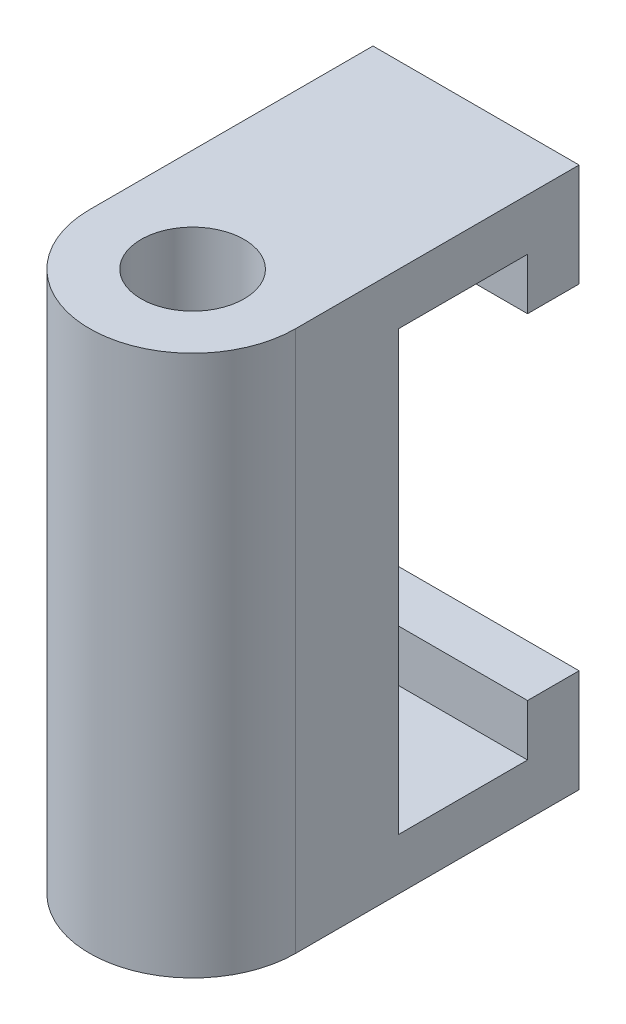
ISO-10303-21;
HEADER;
FILE_DESCRIPTION(('STEP AP214'),'2;1');
FILE_NAME('part.step','',(''),(''),'','','');
FILE_SCHEMA(('AUTOMOTIVE_DESIGN { 1 0 10303 214 1 1 1 1 }'));
ENDSEC;
DATA;
#1=APPLICATION_CONTEXT('core data for automotive mechanical design processes');
#2=APPLICATION_PROTOCOL_DEFINITION('international standard','automotive_design',2000,#1);
#3=PRODUCT_CONTEXT('',#1,'mechanical');
#4=PRODUCT('Part','Part','',(#3));
#5=PRODUCT_RELATED_PRODUCT_CATEGORY('part','',(#4));
#6=PRODUCT_DEFINITION_FORMATION('','',#4);
#7=PRODUCT_DEFINITION_CONTEXT('part definition',#1,'design');
#8=PRODUCT_DEFINITION('design','',#6,#7);
#9=PRODUCT_DEFINITION_SHAPE('','',#8);
#10=(LENGTH_UNIT() NAMED_UNIT(*) SI_UNIT(.MILLI.,.METRE.));
#11=(NAMED_UNIT(*) PLANE_ANGLE_UNIT() SI_UNIT($,.RADIAN.));
#12=(NAMED_UNIT(*) SI_UNIT($,.STERADIAN.) SOLID_ANGLE_UNIT());
#13=UNCERTAINTY_MEASURE_WITH_UNIT(LENGTH_MEASURE(1.E-05),#10,'distance_accuracy_value','');
#14=(GEOMETRIC_REPRESENTATION_CONTEXT(3) GLOBAL_UNCERTAINTY_ASSIGNED_CONTEXT((#13)) GLOBAL_UNIT_ASSIGNED_CONTEXT((#10,
#11,#12)) REPRESENTATION_CONTEXT('',''));
#15=CARTESIAN_POINT('',(0.,0.,0.));
#16=DIRECTION('',(0.,0.,1.));
#17=DIRECTION('',(1.,0.,0.));
#18=AXIS2_PLACEMENT_3D('',#15,#16,#17);
#19=CARTESIAN_POINT('',(-3.175,16.66875,-8.73125));
#20=DIRECTION('',(0.,0.,1.));
#21=DIRECTION('',(1.,0.,0.));
#22=AXIS2_PLACEMENT_3D('',#19,#20,#21);
#23=PLANE('',#22);
#24=DIRECTION('',(0.,-1.,0.));
#25=VECTOR('',#24,1.);
#26=CARTESIAN_POINT('',(-3.175,16.66875,-8.73125));
#27=LINE('',#26,#25);
#28=CARTESIAN_POINT('',(-3.175,3.175,-8.73125));
#29=VERTEX_POINT('',#28);
#30=CARTESIAN_POINT('',(-3.175,0.,-8.73125));
#31=VERTEX_POINT('',#30);
#32=EDGE_CURVE('E150',#29,#31,#27,.T.);
#33=ORIENTED_EDGE('',*,*,#32,.F.);
#34=DIRECTION('',(1.,0.,0.));
#35=VECTOR('',#34,1.);
#36=CARTESIAN_POINT('',(-3.175,3.175,-8.73125));
#37=LINE('',#36,#35);
#38=CARTESIAN_POINT('',(3.175,3.175,-8.73125));
#39=VERTEX_POINT('',#38);
#40=EDGE_CURVE('E175',#29,#39,#37,.T.);
#41=ORIENTED_EDGE('',*,*,#40,.T.);
#42=DIRECTION('',(0.,-1.,0.));
#43=VECTOR('',#42,1.);
#44=CARTESIAN_POINT('',(3.175,16.66875,-8.73125));
#45=LINE('',#44,#43);
#46=CARTESIAN_POINT('',(3.175,0.,-8.73125));
#47=VERTEX_POINT('',#46);
#48=EDGE_CURVE('E149',#39,#47,#45,.T.);
#49=ORIENTED_EDGE('',*,*,#48,.T.);
#50=DIRECTION('',(-1.,0.,0.));
#51=VECTOR('',#50,1.);
#52=CARTESIAN_POINT('',(-3.175,0.,-8.73125));
#53=LINE('',#52,#51);
#54=EDGE_CURVE('E157',#47,#31,#53,.T.);
#55=ORIENTED_EDGE('',*,*,#54,.T.);
#56=EDGE_LOOP('',(#33,#41,#49,#55));
#57=FACE_BOUND('',#56,.T.);
#58=ADVANCED_FACE('F33',(#57),#23,.F.);
#59=CARTESIAN_POINT('',(0.,16.66875,0.));
#60=DIRECTION('',(0.,1.,0.));
#61=DIRECTION('',(0.,0.,1.));
#62=AXIS2_PLACEMENT_3D('',#59,#60,#61);
#63=PLANE('',#62);
#64=CARTESIAN_POINT('',(0.,16.66875,0.));
#65=DIRECTION('',(0.,1.,0.));
#66=DIRECTION('',(0.,0.,1.));
#67=AXIS2_PLACEMENT_3D('',#64,#65,#66);
#68=CIRCLE('',#67,3.175);
#69=CARTESIAN_POINT('',(-3.175,16.66875,0.));
#70=VERTEX_POINT('',#69);
#71=CARTESIAN_POINT('',(3.175,16.66875,0.));
#72=VERTEX_POINT('',#71);
#73=EDGE_CURVE('E156',#70,#72,#68,.T.);
#74=ORIENTED_EDGE('',*,*,#73,.T.);
#75=DIRECTION('',(0.,0.,-1.));
#76=VECTOR('',#75,1.);
#77=CARTESIAN_POINT('',(3.175,16.66875,-8.73125));
#78=LINE('',#77,#76);
#79=CARTESIAN_POINT('',(3.175,16.66875,-8.73125));
#80=VERTEX_POINT('',#79);
#81=EDGE_CURVE('E84',#72,#80,#78,.T.);
#82=ORIENTED_EDGE('',*,*,#81,.T.);
#83=DIRECTION('',(-1.,0.,0.));
#84=VECTOR('',#83,1.);
#85=CARTESIAN_POINT('',(-3.175,16.66875,-8.73125));
#86=LINE('',#85,#84);
#87=CARTESIAN_POINT('',(-3.175,16.66875,-8.73125));
#88=VERTEX_POINT('',#87);
#89=EDGE_CURVE('E168',#80,#88,#86,.T.);
#90=ORIENTED_EDGE('',*,*,#89,.T.);
#91=DIRECTION('',(0.,0.,1.));
#92=VECTOR('',#91,1.);
#93=CARTESIAN_POINT('',(-3.175,16.66875,0.));
#94=LINE('',#93,#92);
#95=EDGE_CURVE('E57',#88,#70,#94,.T.);
#96=ORIENTED_EDGE('',*,*,#95,.T.);
#97=EDGE_LOOP('',(#74,#82,#90,#96));
#98=FACE_BOUND('',#97,.T.);
#99=CARTESIAN_POINT('',(0.,16.66875,0.));
#100=DIRECTION('',(0.,1.,0.));
#101=DIRECTION('',(0.,0.,1.));
#102=AXIS2_PLACEMENT_3D('',#99,#100,#101);
#103=CIRCLE('',#102,1.5875);
#104=CARTESIAN_POINT('',(0.,16.66875,1.5875));
#105=VERTEX_POINT('',#104);
#106=EDGE_CURVE('E166',#105,#105,#103,.T.);
#107=ORIENTED_EDGE('',*,*,#106,.F.);
#108=EDGE_LOOP('',(#107));
#109=FACE_BOUND('',#108,.T.);
#110=ADVANCED_FACE('F254',(#98,#109),#63,.T.);
#111=CARTESIAN_POINT('',(0.,0.,0.));
#112=DIRECTION('',(0.,1.,0.));
#113=DIRECTION('',(0.,0.,1.));
#114=AXIS2_PLACEMENT_3D('',#111,#112,#113);
#115=PLANE('',#114);
#116=CARTESIAN_POINT('',(0.,0.,0.));
#117=DIRECTION('',(0.,1.,0.));
#118=DIRECTION('',(0.,0.,1.));
#119=AXIS2_PLACEMENT_3D('',#116,#117,#118);
#120=CIRCLE('',#119,3.175);
#121=CARTESIAN_POINT('',(-3.175,0.,0.));
#122=VERTEX_POINT('',#121);
#123=CARTESIAN_POINT('',(3.175,0.,0.));
#124=VERTEX_POINT('',#123);
#125=EDGE_CURVE('E163',#122,#124,#120,.T.);
#126=ORIENTED_EDGE('',*,*,#125,.F.);
#127=DIRECTION('',(0.,0.,1.));
#128=VECTOR('',#127,1.);
#129=CARTESIAN_POINT('',(-3.175,0.,0.));
#130=LINE('',#129,#128);
#131=EDGE_CURVE('E77',#31,#122,#130,.T.);
#132=ORIENTED_EDGE('',*,*,#131,.F.);
#133=ORIENTED_EDGE('',*,*,#54,.F.);
#134=DIRECTION('',(0.,0.,-1.));
#135=VECTOR('',#134,1.);
#136=CARTESIAN_POINT('',(3.175,0.,-8.73125));
#137=LINE('',#136,#135);
#138=EDGE_CURVE('E160',#124,#47,#137,.T.);
#139=ORIENTED_EDGE('',*,*,#138,.F.);
#140=EDGE_LOOP('',(#126,#132,#133,#139));
#141=FACE_BOUND('',#140,.T.);
#142=CARTESIAN_POINT('',(0.,0.,0.));
#143=DIRECTION('',(0.,1.,0.));
#144=DIRECTION('',(0.,0.,1.));
#145=AXIS2_PLACEMENT_3D('',#142,#143,#144);
#146=CIRCLE('',#145,1.5875);
#147=CARTESIAN_POINT('',(0.,0.,1.5875));
#148=VERTEX_POINT('',#147);
#149=EDGE_CURVE('E172',#148,#148,#146,.T.);
#150=ORIENTED_EDGE('',*,*,#149,.T.);
#151=EDGE_LOOP('',(#150));
#152=FACE_BOUND('',#151,.T.);
#153=ADVANCED_FACE('F250',(#141,#152),#115,.F.);
#154=CARTESIAN_POINT('',(0.,16.66875,0.));
#155=DIRECTION('',(0.,-1.,0.));
#156=DIRECTION('',(0.,0.,-1.));
#157=AXIS2_PLACEMENT_3D('',#154,#155,#156);
#158=CYLINDRICAL_SURFACE('',#157,3.175);
#159=ORIENTED_EDGE('',*,*,#125,.T.);
#160=DIRECTION('',(0.,-1.,0.));
#161=VECTOR('',#160,1.);
#162=CARTESIAN_POINT('',(3.175,16.66875,0.));
#163=LINE('',#162,#161);
#164=EDGE_CURVE('E11',#72,#124,#163,.T.);
#165=ORIENTED_EDGE('',*,*,#164,.F.);
#166=ORIENTED_EDGE('',*,*,#73,.F.);
#167=DIRECTION('',(0.,-1.,0.));
#168=VECTOR('',#167,1.);
#169=CARTESIAN_POINT('',(-3.175,16.66875,0.));
#170=LINE('',#169,#168);
#171=EDGE_CURVE('E152',#70,#122,#170,.T.);
#172=ORIENTED_EDGE('',*,*,#171,.T.);
#173=EDGE_LOOP('',(#159,#165,#166,#172));
#174=FACE_BOUND('',#173,.T.);
#175=ADVANCED_FACE('F35',(#174),#158,.T.);
#176=CARTESIAN_POINT('',(3.175,16.66875,-8.73125));
#177=DIRECTION('',(-1.,0.,0.));
#178=DIRECTION('',(0.,0.,1.));
#179=AXIS2_PLACEMENT_3D('',#176,#177,#178);
#180=PLANE('',#179);
#181=ORIENTED_EDGE('',*,*,#48,.F.);
#182=DIRECTION('',(0.,0.,-1.));
#183=VECTOR('',#182,1.);
#184=CARTESIAN_POINT('',(3.175,3.175,-7.14375));
#185=LINE('',#184,#183);
#186=CARTESIAN_POINT('',(3.175,3.175,-7.14375));
#187=VERTEX_POINT('',#186);
#188=EDGE_CURVE('E137',#187,#39,#185,.T.);
#189=ORIENTED_EDGE('',*,*,#188,.F.);
#190=DIRECTION('',(0.,1.,0.));
#191=VECTOR('',#190,1.);
#192=CARTESIAN_POINT('',(3.175,1.5875,-7.14375));
#193=LINE('',#192,#191);
#194=CARTESIAN_POINT('',(3.175,1.5875,-7.14375));
#195=VERTEX_POINT('',#194);
#196=EDGE_CURVE('E192',#195,#187,#193,.T.);
#197=ORIENTED_EDGE('',*,*,#196,.F.);
#198=DIRECTION('',(0.,0.,-1.));
#199=VECTOR('',#198,1.);
#200=CARTESIAN_POINT('',(3.175,1.5875,-3.175));
#201=LINE('',#200,#199);
#202=CARTESIAN_POINT('',(3.175,1.5875,-3.175));
#203=VERTEX_POINT('',#202);
#204=EDGE_CURVE('E195',#203,#195,#201,.T.);
#205=ORIENTED_EDGE('',*,*,#204,.F.);
#206=DIRECTION('',(0.,-1.,0.));
#207=VECTOR('',#206,1.);
#208=CARTESIAN_POINT('',(3.175,15.08125,-3.175));
#209=LINE('',#208,#207);
#210=CARTESIAN_POINT('',(3.175,15.08125,-3.175));
#211=VERTEX_POINT('',#210);
#212=EDGE_CURVE('E198',#211,#203,#209,.T.);
#213=ORIENTED_EDGE('',*,*,#212,.F.);
#214=DIRECTION('',(0.,0.,1.));
#215=VECTOR('',#214,1.);
#216=CARTESIAN_POINT('',(3.175,15.08125,-7.14375));
#217=LINE('',#216,#215);
#218=CARTESIAN_POINT('',(3.175,15.08125,-7.14375));
#219=VERTEX_POINT('',#218);
#220=EDGE_CURVE('E201',#219,#211,#217,.T.);
#221=ORIENTED_EDGE('',*,*,#220,.F.);
#222=DIRECTION('',(0.,1.,0.));
#223=VECTOR('',#222,1.);
#224=CARTESIAN_POINT('',(3.175,13.49375,-7.14375));
#225=LINE('',#224,#223);
#226=CARTESIAN_POINT('',(3.175,13.49375,-7.14375));
#227=VERTEX_POINT('',#226);
#228=EDGE_CURVE('E204',#227,#219,#225,.T.);
#229=ORIENTED_EDGE('',*,*,#228,.F.);
#230=DIRECTION('',(0.,0.,1.));
#231=VECTOR('',#230,1.);
#232=CARTESIAN_POINT('',(3.175,13.49375,-8.73125));
#233=LINE('',#232,#231);
#234=CARTESIAN_POINT('',(3.175,13.49375,-8.73125));
#235=VERTEX_POINT('',#234);
#236=EDGE_CURVE('E207',#235,#227,#233,.T.);
#237=ORIENTED_EDGE('',*,*,#236,.F.);
#238=EDGE_CURVE('E41',#80,#235,#45,.T.);
#239=ORIENTED_EDGE('',*,*,#238,.F.);
#240=ORIENTED_EDGE('',*,*,#81,.F.);
#241=ORIENTED_EDGE('',*,*,#164,.T.);
#242=ORIENTED_EDGE('',*,*,#138,.T.);
#243=EDGE_LOOP('',(#181,#189,#197,#205,#213,#221,#229,#237,#239,#240,#241,#242));
#244=FACE_BOUND('',#243,.T.);
#245=ADVANCED_FACE('F245',(#244),#180,.F.);
#246=ORIENTED_EDGE('',*,*,#238,.T.);
#247=DIRECTION('',(1.,0.,0.));
#248=VECTOR('',#247,1.);
#249=CARTESIAN_POINT('',(-3.175,13.49375,-8.73125));
#250=LINE('',#249,#248);
#251=CARTESIAN_POINT('',(-3.175,13.49375,-8.73125));
#252=VERTEX_POINT('',#251);
#253=EDGE_CURVE('E133',#252,#235,#250,.T.);
#254=ORIENTED_EDGE('',*,*,#253,.F.);
#255=EDGE_CURVE('E144',#88,#252,#27,.T.);
#256=ORIENTED_EDGE('',*,*,#255,.F.);
#257=ORIENTED_EDGE('',*,*,#89,.F.);
#258=EDGE_LOOP('',(#246,#254,#256,#257));
#259=FACE_BOUND('',#258,.T.);
#260=ADVANCED_FACE('F142',(#259),#23,.F.);
#261=CARTESIAN_POINT('',(-3.175,16.66875,0.));
#262=DIRECTION('',(1.,0.,0.));
#263=DIRECTION('',(0.,0.,-1.));
#264=AXIS2_PLACEMENT_3D('',#261,#262,#263);
#265=PLANE('',#264);
#266=DIRECTION('',(0.,1.,0.));
#267=VECTOR('',#266,1.);
#268=CARTESIAN_POINT('',(-3.175,1.5875,-7.14375));
#269=LINE('',#268,#267);
#270=CARTESIAN_POINT('',(-3.175,1.5875,-7.14375));
#271=VERTEX_POINT('',#270);
#272=CARTESIAN_POINT('',(-3.175,3.175,-7.14375));
#273=VERTEX_POINT('',#272);
#274=EDGE_CURVE('E211',#271,#273,#269,.T.);
#275=ORIENTED_EDGE('',*,*,#274,.T.);
#276=DIRECTION('',(0.,0.,-1.));
#277=VECTOR('',#276,1.);
#278=CARTESIAN_POINT('',(-3.175,3.175,-7.14375));
#279=LINE('',#278,#277);
#280=EDGE_CURVE('E145',#273,#29,#279,.T.);
#281=ORIENTED_EDGE('',*,*,#280,.T.);
#282=ORIENTED_EDGE('',*,*,#32,.T.);
#283=ORIENTED_EDGE('',*,*,#131,.T.);
#284=ORIENTED_EDGE('',*,*,#171,.F.);
#285=ORIENTED_EDGE('',*,*,#95,.F.);
#286=ORIENTED_EDGE('',*,*,#255,.T.);
#287=DIRECTION('',(0.,0.,1.));
#288=VECTOR('',#287,1.);
#289=CARTESIAN_POINT('',(-3.175,13.49375,-8.73125));
#290=LINE('',#289,#288);
#291=CARTESIAN_POINT('',(-3.175,13.49375,-7.14375));
#292=VERTEX_POINT('',#291);
#293=EDGE_CURVE('E129',#252,#292,#290,.T.);
#294=ORIENTED_EDGE('',*,*,#293,.T.);
#295=DIRECTION('',(0.,1.,0.));
#296=VECTOR('',#295,1.);
#297=CARTESIAN_POINT('',(-3.175,13.49375,-7.14375));
#298=LINE('',#297,#296);
#299=CARTESIAN_POINT('',(-3.175,15.08125,-7.14375));
#300=VERTEX_POINT('',#299);
#301=EDGE_CURVE('E48',#292,#300,#298,.T.);
#302=ORIENTED_EDGE('',*,*,#301,.T.);
#303=DIRECTION('',(0.,0.,1.));
#304=VECTOR('',#303,1.);
#305=CARTESIAN_POINT('',(-3.175,15.08125,-7.14375));
#306=LINE('',#305,#304);
#307=CARTESIAN_POINT('',(-3.175,15.08125,-3.175));
#308=VERTEX_POINT('',#307);
#309=EDGE_CURVE('E219',#300,#308,#306,.T.);
#310=ORIENTED_EDGE('',*,*,#309,.T.);
#311=DIRECTION('',(0.,-1.,0.));
#312=VECTOR('',#311,1.);
#313=CARTESIAN_POINT('',(-3.175,15.08125,-3.175));
#314=LINE('',#313,#312);
#315=CARTESIAN_POINT('',(-3.175,1.5875,-3.175));
#316=VERTEX_POINT('',#315);
#317=EDGE_CURVE('E216',#308,#316,#314,.T.);
#318=ORIENTED_EDGE('',*,*,#317,.T.);
#319=DIRECTION('',(0.,0.,-1.));
#320=VECTOR('',#319,1.);
#321=CARTESIAN_POINT('',(-3.175,1.5875,-3.175));
#322=LINE('',#321,#320);
#323=EDGE_CURVE('E213',#316,#271,#322,.T.);
#324=ORIENTED_EDGE('',*,*,#323,.T.);
#325=EDGE_LOOP('',(#275,#281,#282,#283,#284,#285,#286,#294,#302,#310,#318,#324));
#326=FACE_BOUND('',#325,.T.);
#327=ADVANCED_FACE('F148',(#326),#265,.F.);
#328=CARTESIAN_POINT('',(0.,16.66875,0.));
#329=DIRECTION('',(0.,-1.,0.));
#330=DIRECTION('',(0.,0.,-1.));
#331=AXIS2_PLACEMENT_3D('',#328,#329,#330);
#332=CYLINDRICAL_SURFACE('',#331,1.5875);
#333=ORIENTED_EDGE('',*,*,#106,.T.);
#334=EDGE_LOOP('',(#333));
#335=FACE_BOUND('',#334,.T.);
#336=ORIENTED_EDGE('',*,*,#149,.F.);
#337=EDGE_LOOP('',(#336));
#338=FACE_BOUND('',#337,.T.);
#339=ADVANCED_FACE('F278',(#335,#338),#332,.F.);
#340=CARTESIAN_POINT('',(-3.175,3.175,-7.14375));
#341=DIRECTION('',(0.,-1.,0.));
#342=DIRECTION('',(0.,0.,-1.));
#343=AXIS2_PLACEMENT_3D('',#340,#341,#342);
#344=PLANE('',#343);
#345=ORIENTED_EDGE('',*,*,#188,.T.);
#346=ORIENTED_EDGE('',*,*,#40,.F.);
#347=ORIENTED_EDGE('',*,*,#280,.F.);
#348=DIRECTION('',(1.,0.,0.));
#349=VECTOR('',#348,1.);
#350=CARTESIAN_POINT('',(-3.175,3.175,-7.14375));
#351=LINE('',#350,#349);
#352=EDGE_CURVE('E187',#273,#187,#351,.T.);
#353=ORIENTED_EDGE('',*,*,#352,.T.);
#354=EDGE_LOOP('',(#345,#346,#347,#353));
#355=FACE_BOUND('',#354,.T.);
#356=ADVANCED_FACE('F242',(#355),#344,.F.);
#357=CARTESIAN_POINT('',(-3.175,1.5875,-7.14375));
#358=DIRECTION('',(0.,0.,-1.));
#359=DIRECTION('',(-1.,0.,0.));
#360=AXIS2_PLACEMENT_3D('',#357,#358,#359);
#361=PLANE('',#360);
#362=ORIENTED_EDGE('',*,*,#196,.T.);
#363=ORIENTED_EDGE('',*,*,#352,.F.);
#364=ORIENTED_EDGE('',*,*,#274,.F.);
#365=DIRECTION('',(1.,0.,0.));
#366=VECTOR('',#365,1.);
#367=CARTESIAN_POINT('',(-3.175,1.5875,-7.14375));
#368=LINE('',#367,#366);
#369=EDGE_CURVE('E185',#271,#195,#368,.T.);
#370=ORIENTED_EDGE('',*,*,#369,.T.);
#371=EDGE_LOOP('',(#362,#363,#364,#370));
#372=FACE_BOUND('',#371,.T.);
#373=ADVANCED_FACE('F238',(#372),#361,.F.);
#374=CARTESIAN_POINT('',(-3.175,1.5875,-3.175));
#375=DIRECTION('',(0.,-1.,0.));
#376=DIRECTION('',(0.,0.,-1.));
#377=AXIS2_PLACEMENT_3D('',#374,#375,#376);
#378=PLANE('',#377);
#379=ORIENTED_EDGE('',*,*,#204,.T.);
#380=ORIENTED_EDGE('',*,*,#369,.F.);
#381=ORIENTED_EDGE('',*,*,#323,.F.);
#382=DIRECTION('',(1.,0.,0.));
#383=VECTOR('',#382,1.);
#384=CARTESIAN_POINT('',(-3.175,1.5875,-3.175));
#385=LINE('',#384,#383);
#386=EDGE_CURVE('E183',#316,#203,#385,.T.);
#387=ORIENTED_EDGE('',*,*,#386,.T.);
#388=EDGE_LOOP('',(#379,#380,#381,#387));
#389=FACE_BOUND('',#388,.T.);
#390=ADVANCED_FACE('F233',(#389),#378,.F.);
#391=CARTESIAN_POINT('',(-3.175,15.08125,-3.175));
#392=DIRECTION('',(0.,0.,1.));
#393=DIRECTION('',(0.,-1.,0.));
#394=AXIS2_PLACEMENT_3D('',#391,#392,#393);
#395=PLANE('',#394);
#396=ORIENTED_EDGE('',*,*,#212,.T.);
#397=ORIENTED_EDGE('',*,*,#386,.F.);
#398=ORIENTED_EDGE('',*,*,#317,.F.);
#399=DIRECTION('',(1.,0.,0.));
#400=VECTOR('',#399,1.);
#401=CARTESIAN_POINT('',(-3.175,15.08125,-3.175));
#402=LINE('',#401,#400);
#403=EDGE_CURVE('E181',#308,#211,#402,.T.);
#404=ORIENTED_EDGE('',*,*,#403,.T.);
#405=EDGE_LOOP('',(#396,#397,#398,#404));
#406=FACE_BOUND('',#405,.T.);
#407=ADVANCED_FACE('F229',(#406),#395,.F.);
#408=CARTESIAN_POINT('',(-3.175,15.08125,-7.14375));
#409=DIRECTION('',(0.,1.,0.));
#410=DIRECTION('',(0.,0.,1.));
#411=AXIS2_PLACEMENT_3D('',#408,#409,#410);
#412=PLANE('',#411);
#413=ORIENTED_EDGE('',*,*,#220,.T.);
#414=ORIENTED_EDGE('',*,*,#403,.F.);
#415=ORIENTED_EDGE('',*,*,#309,.F.);
#416=DIRECTION('',(1.,0.,0.));
#417=VECTOR('',#416,1.);
#418=CARTESIAN_POINT('',(-3.175,15.08125,-7.14375));
#419=LINE('',#418,#417);
#420=EDGE_CURVE('E179',#300,#219,#419,.T.);
#421=ORIENTED_EDGE('',*,*,#420,.T.);
#422=EDGE_LOOP('',(#413,#414,#415,#421));
#423=FACE_BOUND('',#422,.T.);
#424=ADVANCED_FACE('F225',(#423),#412,.F.);
#425=CARTESIAN_POINT('',(-3.175,13.49375,-7.14375));
#426=DIRECTION('',(0.,0.,-1.));
#427=DIRECTION('',(0.,1.,0.));
#428=AXIS2_PLACEMENT_3D('',#425,#426,#427);
#429=PLANE('',#428);
#430=ORIENTED_EDGE('',*,*,#228,.T.);
#431=ORIENTED_EDGE('',*,*,#420,.F.);
#432=ORIENTED_EDGE('',*,*,#301,.F.);
#433=DIRECTION('',(1.,0.,0.));
#434=VECTOR('',#433,1.);
#435=CARTESIAN_POINT('',(-3.175,13.49375,-7.14375));
#436=LINE('',#435,#434);
#437=EDGE_CURVE('E135',#292,#227,#436,.T.);
#438=ORIENTED_EDGE('',*,*,#437,.T.);
#439=EDGE_LOOP('',(#430,#431,#432,#438));
#440=FACE_BOUND('',#439,.T.);
#441=ADVANCED_FACE('F257',(#440),#429,.F.);
#442=CARTESIAN_POINT('',(-3.175,13.49375,-8.73125));
#443=DIRECTION('',(0.,1.,0.));
#444=DIRECTION('',(0.,0.,1.));
#445=AXIS2_PLACEMENT_3D('',#442,#443,#444);
#446=PLANE('',#445);
#447=ORIENTED_EDGE('',*,*,#236,.T.);
#448=ORIENTED_EDGE('',*,*,#437,.F.);
#449=ORIENTED_EDGE('',*,*,#293,.F.);
#450=ORIENTED_EDGE('',*,*,#253,.T.);
#451=EDGE_LOOP('',(#447,#448,#449,#450));
#452=FACE_BOUND('',#451,.T.);
#453=ADVANCED_FACE('F132',(#452),#446,.F.);
#454=CLOSED_SHELL('',(#58,#110,#153,#175,#245,#260,#327,#339,#356,#373,#390,#407,#424,#441,#453));
#455=MANIFOLD_SOLID_BREP('B2',#454);
#456=ADVANCED_BREP_SHAPE_REPRESENTATION('',(#18,#455),#14);
#457=SHAPE_DEFINITION_REPRESENTATION(#9,#456);
ENDSEC;
END-ISO-10303-21;
